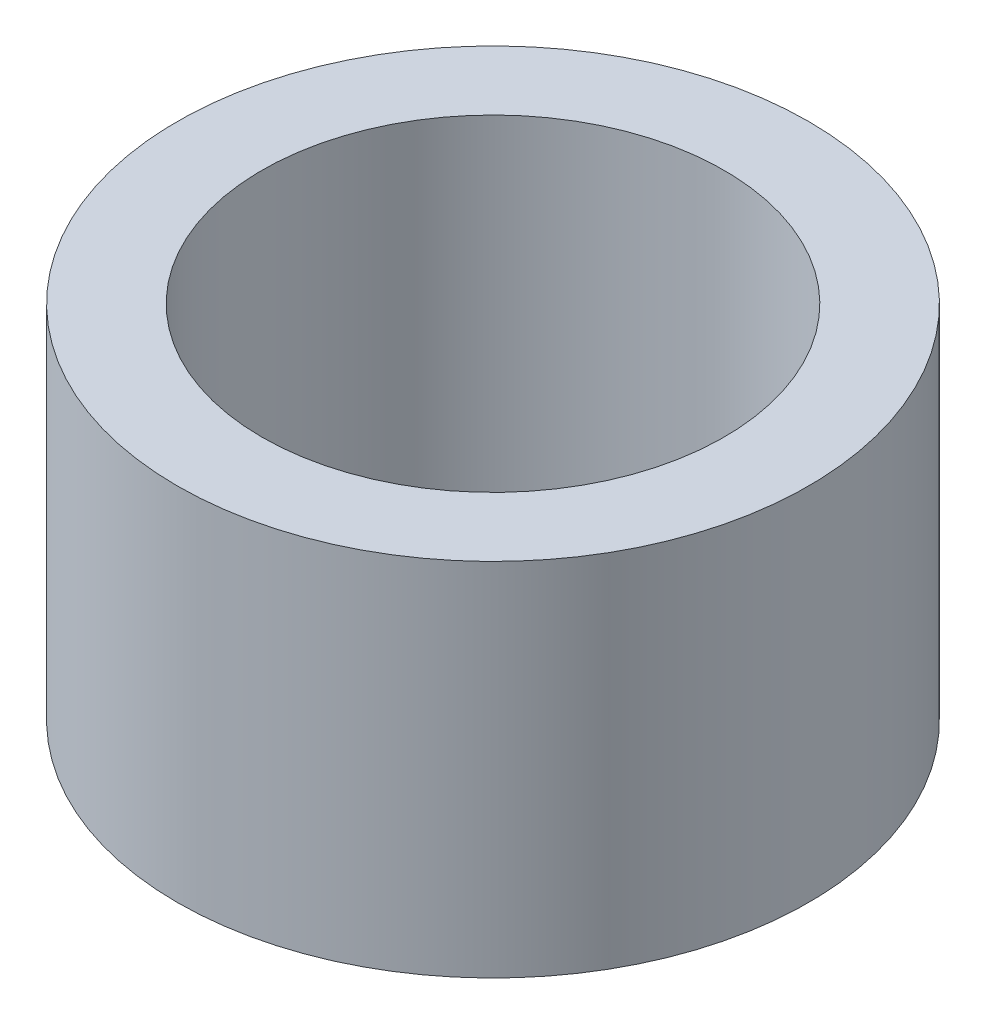
ISO-10303-21;
HEADER;
FILE_DESCRIPTION(('STEP AP214'),'2;1');
FILE_NAME('part.step','',(''),(''),'','','');
FILE_SCHEMA(('AUTOMOTIVE_DESIGN { 1 0 10303 214 1 1 1 1 }'));
ENDSEC;
DATA;
#1=APPLICATION_CONTEXT('core data for automotive mechanical design processes');
#2=APPLICATION_PROTOCOL_DEFINITION('international standard','automotive_design',2000,#1);
#3=PRODUCT_CONTEXT('',#1,'mechanical');
#4=PRODUCT('Part','Part','',(#3));
#5=PRODUCT_RELATED_PRODUCT_CATEGORY('part','',(#4));
#6=PRODUCT_DEFINITION_FORMATION('','',#4);
#7=PRODUCT_DEFINITION_CONTEXT('part definition',#1,'design');
#8=PRODUCT_DEFINITION('design','',#6,#7);
#9=PRODUCT_DEFINITION_SHAPE('','',#8);
#10=(LENGTH_UNIT() NAMED_UNIT(*) SI_UNIT(.MILLI.,.METRE.));
#11=(NAMED_UNIT(*) PLANE_ANGLE_UNIT() SI_UNIT($,.RADIAN.));
#12=(NAMED_UNIT(*) SI_UNIT($,.STERADIAN.) SOLID_ANGLE_UNIT());
#13=UNCERTAINTY_MEASURE_WITH_UNIT(LENGTH_MEASURE(1.E-05),#10,'distance_accuracy_value','');
#14=(GEOMETRIC_REPRESENTATION_CONTEXT(3) GLOBAL_UNCERTAINTY_ASSIGNED_CONTEXT((#13)) GLOBAL_UNIT_ASSIGNED_CONTEXT((#10,
#11,#12)) REPRESENTATION_CONTEXT('',''));
#15=CARTESIAN_POINT('',(0.,0.,0.));
#16=DIRECTION('',(0.,0.,1.));
#17=DIRECTION('',(1.,0.,0.));
#18=AXIS2_PLACEMENT_3D('',#15,#16,#17);
#19=CARTESIAN_POINT('',(0.,6.4,0.));
#20=DIRECTION('',(0.,1.,0.));
#21=DIRECTION('',(0.,0.,1.));
#22=AXIS2_PLACEMENT_3D('',#19,#20,#21);
#23=PLANE('',#22);
#24=CARTESIAN_POINT('',(0.,6.4,0.));
#25=DIRECTION('',(0.,1.,0.));
#26=DIRECTION('',(0.,0.,1.));
#27=AXIS2_PLACEMENT_3D('',#24,#25,#26);
#28=CIRCLE('',#27,5.6);
#29=CARTESIAN_POINT('',(0.,6.4,5.6));
#30=VERTEX_POINT('',#29);
#31=EDGE_CURVE('E10',#30,#30,#28,.T.);
#32=ORIENTED_EDGE('',*,*,#31,.T.);
#33=EDGE_LOOP('',(#32));
#34=FACE_BOUND('',#33,.T.);
#35=CARTESIAN_POINT('',(0.,6.4,0.));
#36=DIRECTION('',(0.,1.,0.));
#37=DIRECTION('',(0.,0.,1.));
#38=AXIS2_PLACEMENT_3D('',#35,#36,#37);
#39=CIRCLE('',#38,4.1);
#40=CARTESIAN_POINT('',(0.,6.4,4.1));
#41=VERTEX_POINT('',#40);
#42=EDGE_CURVE('E47',#41,#41,#39,.T.);
#43=ORIENTED_EDGE('',*,*,#42,.F.);
#44=EDGE_LOOP('',(#43));
#45=FACE_BOUND('',#44,.T.);
#46=ADVANCED_FACE('F36',(#34,#45),#23,.T.);
#47=CARTESIAN_POINT('',(0.,0.,0.));
#48=DIRECTION('',(0.,1.,0.));
#49=DIRECTION('',(0.,0.,1.));
#50=AXIS2_PLACEMENT_3D('',#47,#48,#49);
#51=PLANE('',#50);
#52=CARTESIAN_POINT('',(0.,0.,0.));
#53=DIRECTION('',(0.,1.,0.));
#54=DIRECTION('',(0.,0.,1.));
#55=AXIS2_PLACEMENT_3D('',#52,#53,#54);
#56=CIRCLE('',#55,5.6);
#57=CARTESIAN_POINT('',(0.,0.,5.6));
#58=VERTEX_POINT('',#57);
#59=EDGE_CURVE('E40',#58,#58,#56,.T.);
#60=ORIENTED_EDGE('',*,*,#59,.F.);
#61=EDGE_LOOP('',(#60));
#62=FACE_BOUND('',#61,.T.);
#63=CARTESIAN_POINT('',(0.,0.,0.));
#64=DIRECTION('',(0.,1.,0.));
#65=DIRECTION('',(0.,0.,1.));
#66=AXIS2_PLACEMENT_3D('',#63,#64,#65);
#67=CIRCLE('',#66,4.1);
#68=CARTESIAN_POINT('',(0.,0.,4.1));
#69=VERTEX_POINT('',#68);
#70=EDGE_CURVE('E49',#69,#69,#67,.T.);
#71=ORIENTED_EDGE('',*,*,#70,.T.);
#72=EDGE_LOOP('',(#71));
#73=FACE_BOUND('',#72,.T.);
#74=ADVANCED_FACE('F59',(#62,#73),#51,.F.);
#75=CARTESIAN_POINT('',(0.,6.4,0.));
#76=DIRECTION('',(0.,-1.,0.));
#77=DIRECTION('',(0.,0.,-1.));
#78=AXIS2_PLACEMENT_3D('',#75,#76,#77);
#79=CYLINDRICAL_SURFACE('',#78,5.6);
#80=ORIENTED_EDGE('',*,*,#31,.F.);
#81=EDGE_LOOP('',(#80));
#82=FACE_BOUND('',#81,.T.);
#83=ORIENTED_EDGE('',*,*,#59,.T.);
#84=EDGE_LOOP('',(#83));
#85=FACE_BOUND('',#84,.T.);
#86=ADVANCED_FACE('F38',(#82,#85),#79,.T.);
#87=CARTESIAN_POINT('',(0.,6.4,0.));
#88=DIRECTION('',(0.,-1.,0.));
#89=DIRECTION('',(0.,0.,-1.));
#90=AXIS2_PLACEMENT_3D('',#87,#88,#89);
#91=CYLINDRICAL_SURFACE('',#90,4.1);
#92=ORIENTED_EDGE('',*,*,#42,.T.);
#93=EDGE_LOOP('',(#92));
#94=FACE_BOUND('',#93,.T.);
#95=ORIENTED_EDGE('',*,*,#70,.F.);
#96=EDGE_LOOP('',(#95));
#97=FACE_BOUND('',#96,.T.);
#98=ADVANCED_FACE('F55',(#94,#97),#91,.F.);
#99=CLOSED_SHELL('',(#46,#74,#86,#98));
#100=MANIFOLD_SOLID_BREP('B2',#99);
#101=ADVANCED_BREP_SHAPE_REPRESENTATION('',(#18,#100),#14);
#102=SHAPE_DEFINITION_REPRESENTATION(#9,#101);
ENDSEC;
END-ISO-10303-21;
